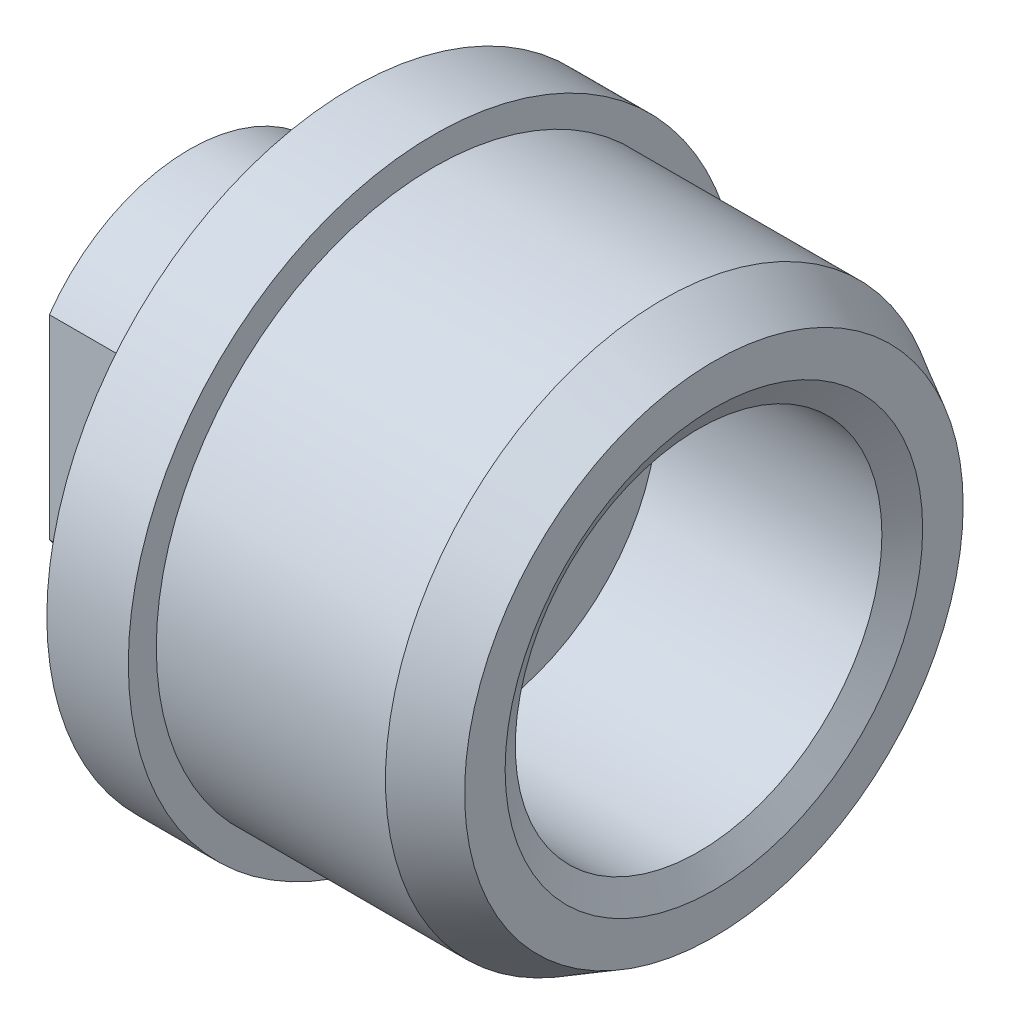
ISO-10303-21;
HEADER;
FILE_DESCRIPTION(('STEP AP214'),'2;1');
FILE_NAME('part.step','',(''),(''),'','','');
FILE_SCHEMA(('AUTOMOTIVE_DESIGN { 1 0 10303 214 1 1 1 1 }'));
ENDSEC;
DATA;
#1=APPLICATION_CONTEXT('core data for automotive mechanical design processes');
#2=APPLICATION_PROTOCOL_DEFINITION('international standard','automotive_design',2000,#1);
#3=PRODUCT_CONTEXT('',#1,'mechanical');
#4=PRODUCT('Part','Part','',(#3));
#5=PRODUCT_RELATED_PRODUCT_CATEGORY('part','',(#4));
#6=PRODUCT_DEFINITION_FORMATION('','',#4);
#7=PRODUCT_DEFINITION_CONTEXT('part definition',#1,'design');
#8=PRODUCT_DEFINITION('design','',#6,#7);
#9=PRODUCT_DEFINITION_SHAPE('','',#8);
#10=(LENGTH_UNIT() NAMED_UNIT(*) SI_UNIT(.MILLI.,.METRE.));
#11=(NAMED_UNIT(*) PLANE_ANGLE_UNIT() SI_UNIT($,.RADIAN.));
#12=(NAMED_UNIT(*) SI_UNIT($,.STERADIAN.) SOLID_ANGLE_UNIT());
#13=UNCERTAINTY_MEASURE_WITH_UNIT(LENGTH_MEASURE(1.E-05),#10,'distance_accuracy_value','');
#14=(GEOMETRIC_REPRESENTATION_CONTEXT(3) GLOBAL_UNCERTAINTY_ASSIGNED_CONTEXT((#13)) GLOBAL_UNIT_ASSIGNED_CONTEXT((#10,
#11,#12)) REPRESENTATION_CONTEXT('',''));
#15=CARTESIAN_POINT('',(0.,0.,0.));
#16=DIRECTION('',(0.,0.,1.));
#17=DIRECTION('',(1.,0.,0.));
#18=AXIS2_PLACEMENT_3D('',#15,#16,#17);
#19=CARTESIAN_POINT('',(0.,0.,0.));
#20=DIRECTION('',(-1.,0.,0.));
#21=DIRECTION('',(0.,0.,1.));
#22=AXIS2_PLACEMENT_3D('',#19,#20,#21);
#23=CYLINDRICAL_SURFACE('',#22,2.032);
#24=CARTESIAN_POINT('',(-13.081,0.,0.));
#25=DIRECTION('',(-1.,0.,0.));
#26=DIRECTION('',(0.,0.,1.));
#27=AXIS2_PLACEMENT_3D('',#24,#25,#26);
#28=CIRCLE('',#27,2.032);
#29=CARTESIAN_POINT('',(-13.081,0.,2.032));
#30=VERTEX_POINT('',#29);
#31=EDGE_CURVE('E116',#30,#30,#28,.T.);
#32=ORIENTED_EDGE('',*,*,#31,.T.);
#33=EDGE_LOOP('',(#32));
#34=FACE_BOUND('',#33,.T.);
#35=CARTESIAN_POINT('',(-5.969,0.,0.));
#36=DIRECTION('',(1.,0.,0.));
#37=DIRECTION('',(0.,0.,-1.));
#38=AXIS2_PLACEMENT_3D('',#35,#36,#37);
#39=CIRCLE('',#38,2.032);
#40=CARTESIAN_POINT('',(-5.969,0.,-2.032));
#41=VERTEX_POINT('',#40);
#42=EDGE_CURVE('E113',#41,#41,#39,.F.);
#43=ORIENTED_EDGE('',*,*,#42,.F.);
#44=EDGE_LOOP('',(#43));
#45=FACE_BOUND('',#44,.T.);
#46=ADVANCED_FACE('F34',(#34,#45),#23,.F.);
#47=CARTESIAN_POINT('',(-13.081,0.,0.));
#48=DIRECTION('',(1.,0.,0.));
#49=DIRECTION('',(0.,0.,-1.));
#50=AXIS2_PLACEMENT_3D('',#47,#48,#49);
#51=CYLINDRICAL_SURFACE('',#50,4.2545);
#52=CARTESIAN_POINT('',(-13.081,0.,0.));
#53=DIRECTION('',(-1.,0.,0.));
#54=DIRECTION('',(0.,0.,1.));
#55=AXIS2_PLACEMENT_3D('',#52,#53,#54);
#56=CIRCLE('',#55,4.2545);
#57=CARTESIAN_POINT('',(-13.081,2.42965306165304,3.4925));
#58=VERTEX_POINT('',#57);
#59=CARTESIAN_POINT('',(-13.081,2.42965306165304,-3.4925));
#60=VERTEX_POINT('',#59);
#61=EDGE_CURVE('E90',#58,#60,#56,.T.);
#62=ORIENTED_EDGE('',*,*,#61,.F.);
#63=DIRECTION('',(-1.,0.,0.));
#64=VECTOR('',#63,1.);
#65=CARTESIAN_POINT('',(-9.017,2.42965306165304,3.4925));
#66=LINE('',#65,#64);
#67=CARTESIAN_POINT('',(-9.017,2.42965306165304,3.4925));
#68=VERTEX_POINT('',#67);
#69=EDGE_CURVE('E77',#68,#58,#66,.T.);
#70=ORIENTED_EDGE('',*,*,#69,.F.);
#71=CARTESIAN_POINT('',(-9.017,0.,0.));
#72=DIRECTION('',(-1.,0.,0.));
#73=DIRECTION('',(0.,0.,1.));
#74=AXIS2_PLACEMENT_3D('',#71,#72,#73);
#75=CIRCLE('',#74,4.2545);
#76=CARTESIAN_POINT('',(-9.017,2.42965306165304,-3.4925));
#77=VERTEX_POINT('',#76);
#78=EDGE_CURVE('E88',#68,#77,#75,.T.);
#79=ORIENTED_EDGE('',*,*,#78,.T.);
#80=DIRECTION('',(-1.,0.,0.));
#81=VECTOR('',#80,1.);
#82=CARTESIAN_POINT('',(-9.017,2.42965306165304,-3.4925));
#83=LINE('',#82,#81);
#84=EDGE_CURVE('E97',#77,#60,#83,.T.);
#85=ORIENTED_EDGE('',*,*,#84,.T.);
#86=EDGE_LOOP('',(#62,#70,#79,#85));
#87=FACE_BOUND('',#86,.T.);
#88=ADVANCED_FACE('F86',(#87),#51,.T.);
#89=CARTESIAN_POINT('',(-9.017,-2.42965306165304,-3.4925));
#90=VERTEX_POINT('',#89);
#91=CARTESIAN_POINT('',(-9.017,-2.42965306165304,3.4925));
#92=VERTEX_POINT('',#91);
#93=EDGE_CURVE('E95',#90,#92,#75,.T.);
#94=ORIENTED_EDGE('',*,*,#93,.T.);
#95=DIRECTION('',(-1.,0.,0.));
#96=VECTOR('',#95,1.);
#97=CARTESIAN_POINT('',(-9.017,-2.42965306165304,3.4925));
#98=LINE('',#97,#96);
#99=CARTESIAN_POINT('',(-13.081,-2.42965306165304,3.4925));
#100=VERTEX_POINT('',#99);
#101=EDGE_CURVE('E80',#92,#100,#98,.T.);
#102=ORIENTED_EDGE('',*,*,#101,.T.);
#103=CARTESIAN_POINT('',(-13.081,-2.42965306165304,-3.4925));
#104=VERTEX_POINT('',#103);
#105=EDGE_CURVE('E101',#104,#100,#56,.T.);
#106=ORIENTED_EDGE('',*,*,#105,.F.);
#107=DIRECTION('',(-1.,0.,0.));
#108=VECTOR('',#107,1.);
#109=CARTESIAN_POINT('',(-9.017,-2.42965306165304,-3.4925));
#110=LINE('',#109,#108);
#111=EDGE_CURVE('E57',#90,#104,#110,.T.);
#112=ORIENTED_EDGE('',*,*,#111,.F.);
#113=EDGE_LOOP('',(#94,#102,#106,#112));
#114=FACE_BOUND('',#113,.T.);
#115=ADVANCED_FACE('F142',(#114),#51,.T.);
#116=CARTESIAN_POINT('',(-13.081,0.,0.));
#117=DIRECTION('',(-1.,0.,0.));
#118=DIRECTION('',(0.,0.,1.));
#119=AXIS2_PLACEMENT_3D('',#116,#117,#118);
#120=PLANE('',#119);
#121=ORIENTED_EDGE('',*,*,#31,.F.);
#122=EDGE_LOOP('',(#121));
#123=FACE_BOUND('',#122,.T.);
#124=DIRECTION('',(0.,-1.,0.));
#125=VECTOR('',#124,1.);
#126=CARTESIAN_POINT('',(-13.081,-9.50132135623731,3.4925));
#127=LINE('',#126,#125);
#128=EDGE_CURVE('E82',#58,#100,#127,.T.);
#129=ORIENTED_EDGE('',*,*,#128,.F.);
#130=ORIENTED_EDGE('',*,*,#61,.T.);
#131=DIRECTION('',(0.,-1.,0.));
#132=VECTOR('',#131,1.);
#133=CARTESIAN_POINT('',(-13.081,-9.50132135623731,-3.4925));
#134=LINE('',#133,#132);
#135=EDGE_CURVE('E290',#60,#104,#134,.T.);
#136=ORIENTED_EDGE('',*,*,#135,.T.);
#137=ORIENTED_EDGE('',*,*,#105,.T.);
#138=EDGE_LOOP('',(#129,#130,#136,#137));
#139=FACE_BOUND('',#138,.T.);
#140=ADVANCED_FACE('F156',(#123,#139),#120,.T.);
#141=CARTESIAN_POINT('',(-9.017,0.,0.));
#142=DIRECTION('',(-1.,0.,0.));
#143=DIRECTION('',(0.,0.,1.));
#144=AXIS2_PLACEMENT_3D('',#141,#142,#143);
#145=PLANE('',#144);
#146=CARTESIAN_POINT('',(-9.017,0.,0.));
#147=DIRECTION('',(-1.,0.,0.));
#148=DIRECTION('',(0.,0.,1.));
#149=AXIS2_PLACEMENT_3D('',#146,#147,#148);
#150=CIRCLE('',#149,7.62);
#151=CARTESIAN_POINT('',(-9.017,0.,7.62));
#152=VERTEX_POINT('',#151);
#153=EDGE_CURVE('E103',#152,#152,#150,.T.);
#154=ORIENTED_EDGE('',*,*,#153,.T.);
#155=EDGE_LOOP('',(#154));
#156=FACE_BOUND('',#155,.T.);
#157=ORIENTED_EDGE('',*,*,#93,.F.);
#158=DIRECTION('',(0.,-1.,0.));
#159=VECTOR('',#158,1.);
#160=CARTESIAN_POINT('',(-9.017,-9.50132135623731,-3.4925));
#161=LINE('',#160,#159);
#162=EDGE_CURVE('E94',#77,#90,#161,.T.);
#163=ORIENTED_EDGE('',*,*,#162,.F.);
#164=ORIENTED_EDGE('',*,*,#78,.F.);
#165=DIRECTION('',(0.,-1.,0.));
#166=VECTOR('',#165,1.);
#167=CARTESIAN_POINT('',(-9.017,-9.50132135623731,3.4925));
#168=LINE('',#167,#166);
#169=EDGE_CURVE('E49',#68,#92,#168,.T.);
#170=ORIENTED_EDGE('',*,*,#169,.T.);
#171=EDGE_LOOP('',(#157,#163,#164,#170));
#172=FACE_BOUND('',#171,.T.);
#173=ADVANCED_FACE('F93',(#156,#172),#145,.T.);
#174=CARTESIAN_POINT('',(-6.985,0.,0.));
#175=DIRECTION('',(1.,0.,0.));
#176=DIRECTION('',(0.,0.,-1.));
#177=AXIS2_PLACEMENT_3D('',#174,#175,#176);
#178=CYLINDRICAL_SURFACE('',#177,6.9215);
#179=CARTESIAN_POINT('',(-1.27000000000001,0.,0.));
#180=DIRECTION('',(1.,0.,0.));
#181=DIRECTION('',(0.,0.,-1.));
#182=AXIS2_PLACEMENT_3D('',#179,#180,#181);
#183=CIRCLE('',#182,6.9215);
#184=CARTESIAN_POINT('',(-1.27000000000001,0.,-6.9215));
#185=VERTEX_POINT('',#184);
#186=EDGE_CURVE('E120',#185,#185,#183,.F.);
#187=ORIENTED_EDGE('',*,*,#186,.T.);
#188=EDGE_LOOP('',(#187));
#189=FACE_BOUND('',#188,.T.);
#190=CARTESIAN_POINT('',(-6.985,0.,0.));
#191=DIRECTION('',(-1.,0.,0.));
#192=DIRECTION('',(0.,0.,1.));
#193=AXIS2_PLACEMENT_3D('',#190,#191,#192);
#194=CIRCLE('',#193,6.9215);
#195=CARTESIAN_POINT('',(-6.985,0.,6.9215));
#196=VERTEX_POINT('',#195);
#197=EDGE_CURVE('E106',#196,#196,#194,.F.);
#198=ORIENTED_EDGE('',*,*,#197,.T.);
#199=EDGE_LOOP('',(#198));
#200=FACE_BOUND('',#199,.T.);
#201=ADVANCED_FACE('F164',(#189,#200),#178,.T.);
#202=CARTESIAN_POINT('',(0.,0.,0.));
#203=DIRECTION('',(1.,0.,0.));
#204=DIRECTION('',(0.,0.,-1.));
#205=AXIS2_PLACEMENT_3D('',#202,#203,#204);
#206=PLANE('',#205);
#207=CARTESIAN_POINT('',(0.,0.,0.));
#208=DIRECTION('',(1.,0.,0.));
#209=DIRECTION('',(0.,0.,-1.));
#210=AXIS2_PLACEMENT_3D('',#207,#208,#209);
#211=CIRCLE('',#210,5.207);
#212=CARTESIAN_POINT('',(0.,0.,-5.207));
#213=VERTEX_POINT('',#212);
#214=EDGE_CURVE('E11',#213,#213,#211,.F.);
#215=ORIENTED_EDGE('',*,*,#214,.T.);
#216=EDGE_LOOP('',(#215));
#217=FACE_BOUND('',#216,.T.);
#218=CARTESIAN_POINT('',(0.,0.,0.));
#219=DIRECTION('',(1.,0.,0.));
#220=DIRECTION('',(0.,0.,-1.));
#221=AXIS2_PLACEMENT_3D('',#218,#219,#220);
#222=CIRCLE('',#221,6.21752750465498);
#223=CARTESIAN_POINT('',(0.,0.,-6.21752750465498));
#224=VERTEX_POINT('',#223);
#225=EDGE_CURVE('E112',#224,#224,#222,.T.);
#226=ORIENTED_EDGE('',*,*,#225,.T.);
#227=EDGE_LOOP('',(#226));
#228=FACE_BOUND('',#227,.T.);
#229=ADVANCED_FACE('F172',(#217,#228),#206,.T.);
#230=CARTESIAN_POINT('',(-9.017,0.,0.));
#231=DIRECTION('',(1.,0.,0.));
#232=DIRECTION('',(0.,0.,-1.));
#233=AXIS2_PLACEMENT_3D('',#230,#231,#232);
#234=CYLINDRICAL_SURFACE('',#233,7.62);
#235=ORIENTED_EDGE('',*,*,#153,.F.);
#236=EDGE_LOOP('',(#235));
#237=FACE_BOUND('',#236,.T.);
#238=CARTESIAN_POINT('',(-6.985,0.,0.));
#239=DIRECTION('',(-1.,0.,0.));
#240=DIRECTION('',(0.,0.,1.));
#241=AXIS2_PLACEMENT_3D('',#238,#239,#240);
#242=CIRCLE('',#241,7.62);
#243=CARTESIAN_POINT('',(-6.985,0.,7.62));
#244=VERTEX_POINT('',#243);
#245=EDGE_CURVE('E107',#244,#244,#242,.T.);
#246=ORIENTED_EDGE('',*,*,#245,.T.);
#247=EDGE_LOOP('',(#246));
#248=FACE_BOUND('',#247,.T.);
#249=ADVANCED_FACE('F168',(#237,#248),#234,.T.);
#250=CARTESIAN_POINT('',(-6.985,0.,0.));
#251=DIRECTION('',(-1.,0.,0.));
#252=DIRECTION('',(0.,0.,1.));
#253=AXIS2_PLACEMENT_3D('',#250,#251,#252);
#254=PLANE('',#253);
#255=ORIENTED_EDGE('',*,*,#197,.F.);
#256=EDGE_LOOP('',(#255));
#257=FACE_BOUND('',#256,.T.);
#258=ORIENTED_EDGE('',*,*,#245,.F.);
#259=EDGE_LOOP('',(#258));
#260=FACE_BOUND('',#259,.T.);
#261=ADVANCED_FACE('F155',(#257,#260),#254,.F.);
#262=CARTESIAN_POINT('',(-9.017,-9.50132135623731,-3.4925));
#263=DIRECTION('',(0.,0.,-1.));
#264=DIRECTION('',(-1.,0.,0.));
#265=AXIS2_PLACEMENT_3D('',#262,#263,#264);
#266=PLANE('',#265);
#267=ORIENTED_EDGE('',*,*,#135,.F.);
#268=ORIENTED_EDGE('',*,*,#84,.F.);
#269=ORIENTED_EDGE('',*,*,#162,.T.);
#270=ORIENTED_EDGE('',*,*,#111,.T.);
#271=EDGE_LOOP('',(#267,#268,#269,#270));
#272=FACE_BOUND('',#271,.T.);
#273=ADVANCED_FACE('F152',(#272),#266,.T.);
#274=CARTESIAN_POINT('',(-9.017,-9.50132135623731,3.4925));
#275=DIRECTION('',(0.,0.,-1.));
#276=DIRECTION('',(-1.,0.,0.));
#277=AXIS2_PLACEMENT_3D('',#274,#275,#276);
#278=PLANE('',#277);
#279=ORIENTED_EDGE('',*,*,#128,.T.);
#280=ORIENTED_EDGE('',*,*,#101,.F.);
#281=ORIENTED_EDGE('',*,*,#169,.F.);
#282=ORIENTED_EDGE('',*,*,#69,.T.);
#283=EDGE_LOOP('',(#279,#280,#281,#282));
#284=FACE_BOUND('',#283,.T.);
#285=ADVANCED_FACE('F76',(#284),#278,.F.);
#286=CARTESIAN_POINT('',(-5.969,0.,0.));
#287=DIRECTION('',(1.,0.,0.));
#288=DIRECTION('',(0.,0.,-1.));
#289=AXIS2_PLACEMENT_3D('',#286,#287,#288);
#290=PLANE('',#289);
#291=CARTESIAN_POINT('',(-5.969,0.,0.));
#292=DIRECTION('',(1.,0.,0.));
#293=DIRECTION('',(0.,0.,-1.));
#294=AXIS2_PLACEMENT_3D('',#291,#292,#293);
#295=CIRCLE('',#294,4.572);
#296=CARTESIAN_POINT('',(-5.969,0.,-4.572));
#297=VERTEX_POINT('',#296);
#298=EDGE_CURVE('E117',#297,#297,#295,.T.);
#299=ORIENTED_EDGE('',*,*,#298,.T.);
#300=EDGE_LOOP('',(#299));
#301=FACE_BOUND('',#300,.T.);
#302=ORIENTED_EDGE('',*,*,#42,.T.);
#303=EDGE_LOOP('',(#302));
#304=FACE_BOUND('',#303,.T.);
#305=ADVANCED_FACE('F151',(#301,#304),#290,.T.);
#306=CARTESIAN_POINT('',(-5.969,0.,0.));
#307=DIRECTION('',(1.,0.,0.));
#308=DIRECTION('',(0.,0.,-1.));
#309=AXIS2_PLACEMENT_3D('',#306,#307,#308);
#310=CYLINDRICAL_SURFACE('',#309,4.572);
#311=CARTESIAN_POINT('',(-0.381546493082499,0.,0.));
#312=DIRECTION('',(1.,0.,0.));
#313=DIRECTION('',(0.,0.,-1.));
#314=AXIS2_PLACEMENT_3D('',#311,#312,#313);
#315=CIRCLE('',#314,4.572);
#316=CARTESIAN_POINT('',(-0.381546493082499,0.,-4.572));
#317=VERTEX_POINT('',#316);
#318=EDGE_CURVE('E42',#317,#317,#315,.T.);
#319=ORIENTED_EDGE('',*,*,#318,.T.);
#320=EDGE_LOOP('',(#319));
#321=FACE_BOUND('',#320,.T.);
#322=ORIENTED_EDGE('',*,*,#298,.F.);
#323=EDGE_LOOP('',(#322));
#324=FACE_BOUND('',#323,.T.);
#325=ADVANCED_FACE('F125',(#321,#324),#310,.F.);
#326=CARTESIAN_POINT('',(0.,0.,0.));
#327=DIRECTION('',(-1.,0.,0.));
#328=DIRECTION('',(0.,0.,1.));
#329=AXIS2_PLACEMENT_3D('',#326,#327,#328);
#330=CONICAL_SURFACE('',#329,6.21752750465498,0.506145483078353);
#331=ORIENTED_EDGE('',*,*,#186,.F.);
#332=EDGE_LOOP('',(#331));
#333=FACE_BOUND('',#332,.T.);
#334=ORIENTED_EDGE('',*,*,#225,.F.);
#335=EDGE_LOOP('',(#334));
#336=FACE_BOUND('',#335,.T.);
#337=ADVANCED_FACE('F129',(#333,#336),#330,.T.);
#338=CARTESIAN_POINT('',(-0.381546493082499,0.,0.));
#339=DIRECTION('',(1.,0.,0.));
#340=DIRECTION('',(0.,0.,-1.));
#341=AXIS2_PLACEMENT_3D('',#338,#339,#340);
#342=CONICAL_SURFACE('',#341,4.572,1.02974425867666);
#343=ORIENTED_EDGE('',*,*,#214,.F.);
#344=EDGE_LOOP('',(#343));
#345=FACE_BOUND('',#344,.T.);
#346=ORIENTED_EDGE('',*,*,#318,.F.);
#347=EDGE_LOOP('',(#346));
#348=FACE_BOUND('',#347,.T.);
#349=ADVANCED_FACE('F36',(#345,#348),#342,.F.);
#350=CLOSED_SHELL('',(#46,#88,#115,#140,#173,#201,#229,#249,#261,#273,#285,#305,#325,#337,#349));
#351=MANIFOLD_SOLID_BREP('B2',#350);
#352=ADVANCED_BREP_SHAPE_REPRESENTATION('',(#18,#351),#14);
#353=SHAPE_DEFINITION_REPRESENTATION(#9,#352);
ENDSEC;
END-ISO-10303-21;
